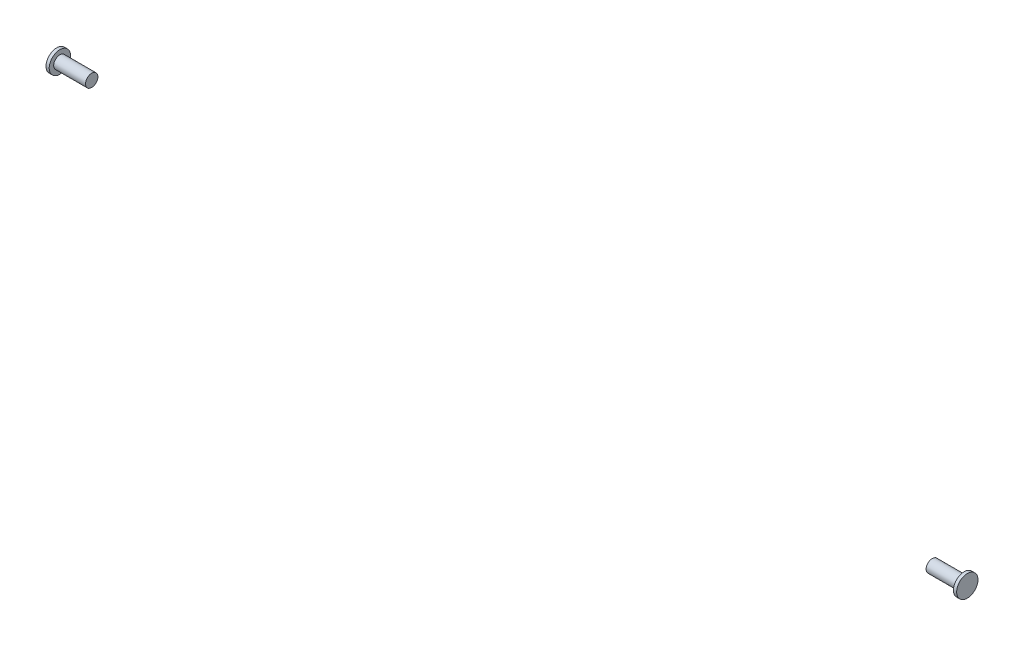
ISO-10303-21;
HEADER;
FILE_DESCRIPTION(('STEP AP214'),'2;1');
FILE_NAME('part.step','',(''),(''),'','','');
FILE_SCHEMA(('AUTOMOTIVE_DESIGN { 1 0 10303 214 1 1 1 1 }'));
ENDSEC;
DATA;
#1=APPLICATION_CONTEXT('core data for automotive mechanical design processes');
#2=APPLICATION_PROTOCOL_DEFINITION('international standard','automotive_design',2000,#1);
#3=PRODUCT_CONTEXT('',#1,'mechanical');
#4=PRODUCT('Part','Part','',(#3));
#5=PRODUCT_RELATED_PRODUCT_CATEGORY('part','',(#4));
#6=PRODUCT_DEFINITION_FORMATION('','',#4);
#7=PRODUCT_DEFINITION_CONTEXT('part definition',#1,'design');
#8=PRODUCT_DEFINITION('design','',#6,#7);
#9=PRODUCT_DEFINITION_SHAPE('','',#8);
#10=(LENGTH_UNIT() NAMED_UNIT(*) SI_UNIT(.MILLI.,.METRE.));
#11=(NAMED_UNIT(*) PLANE_ANGLE_UNIT() SI_UNIT($,.RADIAN.));
#12=(NAMED_UNIT(*) SI_UNIT($,.STERADIAN.) SOLID_ANGLE_UNIT());
#13=UNCERTAINTY_MEASURE_WITH_UNIT(LENGTH_MEASURE(1.E-05),#10,'distance_accuracy_value','');
#14=(GEOMETRIC_REPRESENTATION_CONTEXT(3) GLOBAL_UNCERTAINTY_ASSIGNED_CONTEXT((#13)) GLOBAL_UNIT_ASSIGNED_CONTEXT((#10,
#11,#12)) REPRESENTATION_CONTEXT('',''));
#15=CARTESIAN_POINT('',(0.,0.,0.));
#16=DIRECTION('',(0.,0.,1.));
#17=DIRECTION('',(1.,0.,0.));
#18=AXIS2_PLACEMENT_3D('',#15,#16,#17);
#19=CARTESIAN_POINT('',(-196.8,-211.,63.5));
#20=DIRECTION('',(1.,0.,0.));
#21=DIRECTION('',(0.,0.,-1.));
#22=AXIS2_PLACEMENT_3D('',#19,#20,#21);
#23=PLANE('',#22);
#24=CARTESIAN_POINT('',(-196.8,-211.,63.5));
#25=DIRECTION('',(-1.,0.,0.));
#26=DIRECTION('',(0.,0.,1.));
#27=AXIS2_PLACEMENT_3D('',#24,#25,#26);
#28=CIRCLE('',#27,2.9);
#29=CARTESIAN_POINT('',(-196.8,-211.,66.4));
#30=VERTEX_POINT('',#29);
#31=EDGE_CURVE('P0_E23',#30,#30,#28,.T.);
#32=ORIENTED_EDGE('',*,*,#31,.F.);
#33=EDGE_LOOP('',(#32));
#34=FACE_BOUND('',#33,.T.);
#35=ADVANCED_FACE('P0_F15',(#34),#23,.T.);
#36=CARTESIAN_POINT('',(-213.2,-211.,63.5));
#37=DIRECTION('',(1.,0.,0.));
#38=DIRECTION('',(0.,0.,-1.));
#39=AXIS2_PLACEMENT_3D('',#36,#37,#38);
#40=CYLINDRICAL_SURFACE('',#39,2.9);
#41=CARTESIAN_POINT('',(-211.7,-211.,63.5));
#42=DIRECTION('',(1.,0.,0.));
#43=DIRECTION('',(0.,0.,-1.));
#44=AXIS2_PLACEMENT_3D('',#41,#42,#43);
#45=CIRCLE('',#44,2.9);
#46=CARTESIAN_POINT('',(-211.7,-211.,60.6));
#47=VERTEX_POINT('',#46);
#48=EDGE_CURVE('P0_E10',#47,#47,#45,.F.);
#49=ORIENTED_EDGE('',*,*,#48,.F.);
#50=EDGE_LOOP('',(#49));
#51=FACE_BOUND('',#50,.T.);
#52=ORIENTED_EDGE('',*,*,#31,.T.);
#53=EDGE_LOOP('',(#52));
#54=FACE_BOUND('',#53,.T.);
#55=ADVANCED_FACE('P0_F17',(#51,#54),#40,.T.);
#56=CARTESIAN_POINT('',(-211.7,-211.,63.5));
#57=DIRECTION('',(1.,0.,0.));
#58=DIRECTION('',(0.,0.,-1.));
#59=AXIS2_PLACEMENT_3D('',#56,#57,#58);
#60=PLANE('',#59);
#61=ORIENTED_EDGE('',*,*,#48,.T.);
#62=EDGE_LOOP('',(#61));
#63=FACE_BOUND('',#62,.T.);
#64=CARTESIAN_POINT('',(-211.7,-211.,63.5));
#65=DIRECTION('',(-1.,0.,0.));
#66=DIRECTION('',(0.,0.,1.));
#67=AXIS2_PLACEMENT_3D('',#64,#65,#66);
#68=CIRCLE('',#67,5.);
#69=CARTESIAN_POINT('',(-211.7,-211.,68.5));
#70=VERTEX_POINT('',#69);
#71=EDGE_CURVE('P0_E34',#70,#70,#68,.T.);
#72=ORIENTED_EDGE('',*,*,#71,.F.);
#73=EDGE_LOOP('',(#72));
#74=FACE_BOUND('',#73,.T.);
#75=ADVANCED_FACE('P0_F43',(#63,#74),#60,.T.);
#76=CARTESIAN_POINT('',(-211.7,-211.,63.5));
#77=DIRECTION('',(-1.,0.,0.));
#78=DIRECTION('',(0.,0.,1.));
#79=AXIS2_PLACEMENT_3D('',#76,#77,#78);
#80=CYLINDRICAL_SURFACE('',#79,5.);
#81=CARTESIAN_POINT('',(-213.2,-211.,63.5));
#82=DIRECTION('',(1.,0.,0.));
#83=DIRECTION('',(0.,0.,-1.));
#84=AXIS2_PLACEMENT_3D('',#81,#82,#83);
#85=CIRCLE('',#84,5.);
#86=CARTESIAN_POINT('',(-213.2,-211.,58.5));
#87=VERTEX_POINT('',#86);
#88=EDGE_CURVE('P0_E30',#87,#87,#85,.T.);
#89=ORIENTED_EDGE('',*,*,#88,.T.);
#90=EDGE_LOOP('',(#89));
#91=FACE_BOUND('',#90,.T.);
#92=ORIENTED_EDGE('',*,*,#71,.T.);
#93=EDGE_LOOP('',(#92));
#94=FACE_BOUND('',#93,.T.);
#95=ADVANCED_FACE('P0_F41',(#91,#94),#80,.T.);
#96=CARTESIAN_POINT('',(-213.2,-211.,63.5));
#97=DIRECTION('',(-1.,0.,0.));
#98=DIRECTION('',(0.,0.,1.));
#99=AXIS2_PLACEMENT_3D('',#96,#97,#98);
#100=PLANE('',#99);
#101=ORIENTED_EDGE('',*,*,#88,.F.);
#102=EDGE_LOOP('',(#101));
#103=FACE_BOUND('',#102,.T.);
#104=ADVANCED_FACE('P0_F50',(#103),#100,.T.);
#105=CLOSED_SHELL('',(#35,#55,#75,#95,#104));
#106=MANIFOLD_SOLID_BREP('P0_B1',#105);
#107=CARTESIAN_POINT('',(196.8,-211.,63.5));
#108=DIRECTION('',(-1.,0.,0.));
#109=DIRECTION('',(0.,0.,1.));
#110=AXIS2_PLACEMENT_3D('',#107,#108,#109);
#111=PLANE('',#110);
#112=CARTESIAN_POINT('',(196.8,-211.,63.5));
#113=DIRECTION('',(1.,0.,0.));
#114=DIRECTION('',(0.,0.,-1.));
#115=AXIS2_PLACEMENT_3D('',#112,#113,#114);
#116=CIRCLE('',#115,2.9);
#117=CARTESIAN_POINT('',(196.8,-211.,60.6));
#118=VERTEX_POINT('',#117);
#119=EDGE_CURVE('P1_E23',#118,#118,#116,.T.);
#120=ORIENTED_EDGE('',*,*,#119,.F.);
#121=EDGE_LOOP('',(#120));
#122=FACE_BOUND('',#121,.T.);
#123=ADVANCED_FACE('P1_F15',(#122),#111,.T.);
#124=CARTESIAN_POINT('',(196.8,-211.,63.5));
#125=DIRECTION('',(1.,0.,0.));
#126=DIRECTION('',(0.,0.,-1.));
#127=AXIS2_PLACEMENT_3D('',#124,#125,#126);
#128=CYLINDRICAL_SURFACE('',#127,2.9);
#129=CARTESIAN_POINT('',(211.7,-211.,63.5));
#130=DIRECTION('',(-1.,0.,0.));
#131=DIRECTION('',(0.,0.,1.));
#132=AXIS2_PLACEMENT_3D('',#129,#130,#131);
#133=CIRCLE('',#132,2.9);
#134=CARTESIAN_POINT('',(211.7,-211.,66.4));
#135=VERTEX_POINT('',#134);
#136=EDGE_CURVE('P1_E10',#135,#135,#133,.F.);
#137=ORIENTED_EDGE('',*,*,#136,.F.);
#138=EDGE_LOOP('',(#137));
#139=FACE_BOUND('',#138,.T.);
#140=ORIENTED_EDGE('',*,*,#119,.T.);
#141=EDGE_LOOP('',(#140));
#142=FACE_BOUND('',#141,.T.);
#143=ADVANCED_FACE('P1_F17',(#139,#142),#128,.T.);
#144=CARTESIAN_POINT('',(211.7,-211.,63.5));
#145=DIRECTION('',(-1.,0.,0.));
#146=DIRECTION('',(0.,0.,1.));
#147=AXIS2_PLACEMENT_3D('',#144,#145,#146);
#148=PLANE('',#147);
#149=ORIENTED_EDGE('',*,*,#136,.T.);
#150=EDGE_LOOP('',(#149));
#151=FACE_BOUND('',#150,.T.);
#152=CARTESIAN_POINT('',(211.7,-211.,63.5));
#153=DIRECTION('',(1.,0.,0.));
#154=DIRECTION('',(0.,0.,-1.));
#155=AXIS2_PLACEMENT_3D('',#152,#153,#154);
#156=CIRCLE('',#155,5.);
#157=CARTESIAN_POINT('',(211.7,-211.,58.5));
#158=VERTEX_POINT('',#157);
#159=EDGE_CURVE('P1_E35',#158,#158,#156,.T.);
#160=ORIENTED_EDGE('',*,*,#159,.F.);
#161=EDGE_LOOP('',(#160));
#162=FACE_BOUND('',#161,.T.);
#163=ADVANCED_FACE('P1_F43',(#151,#162),#148,.T.);
#164=CARTESIAN_POINT('',(211.7,-211.,63.5));
#165=DIRECTION('',(1.,0.,0.));
#166=DIRECTION('',(0.,0.,-1.));
#167=AXIS2_PLACEMENT_3D('',#164,#165,#166);
#168=CYLINDRICAL_SURFACE('',#167,5.);
#169=CARTESIAN_POINT('',(213.2,-211.,63.5));
#170=DIRECTION('',(-1.,0.,0.));
#171=DIRECTION('',(0.,0.,1.));
#172=AXIS2_PLACEMENT_3D('',#169,#170,#171);
#173=CIRCLE('',#172,5.);
#174=CARTESIAN_POINT('',(213.2,-211.,68.5));
#175=VERTEX_POINT('',#174);
#176=EDGE_CURVE('P1_E30',#175,#175,#173,.T.);
#177=ORIENTED_EDGE('',*,*,#176,.T.);
#178=EDGE_LOOP('',(#177));
#179=FACE_BOUND('',#178,.T.);
#180=ORIENTED_EDGE('',*,*,#159,.T.);
#181=EDGE_LOOP('',(#180));
#182=FACE_BOUND('',#181,.T.);
#183=ADVANCED_FACE('P1_F41',(#179,#182),#168,.T.);
#184=CARTESIAN_POINT('',(213.2,-211.,63.5));
#185=DIRECTION('',(1.,0.,0.));
#186=DIRECTION('',(0.,0.,-1.));
#187=AXIS2_PLACEMENT_3D('',#184,#185,#186);
#188=PLANE('',#187);
#189=ORIENTED_EDGE('',*,*,#176,.F.);
#190=EDGE_LOOP('',(#189));
#191=FACE_BOUND('',#190,.T.);
#192=ADVANCED_FACE('P1_F50',(#191),#188,.T.);
#193=CLOSED_SHELL('',(#123,#143,#163,#183,#192));
#194=MANIFOLD_SOLID_BREP('P1_B1',#193);
#195=ADVANCED_BREP_SHAPE_REPRESENTATION('',(#18,#106,#194),#14);
#196=SHAPE_DEFINITION_REPRESENTATION(#9,#195);
ENDSEC;
END-ISO-10303-21;
